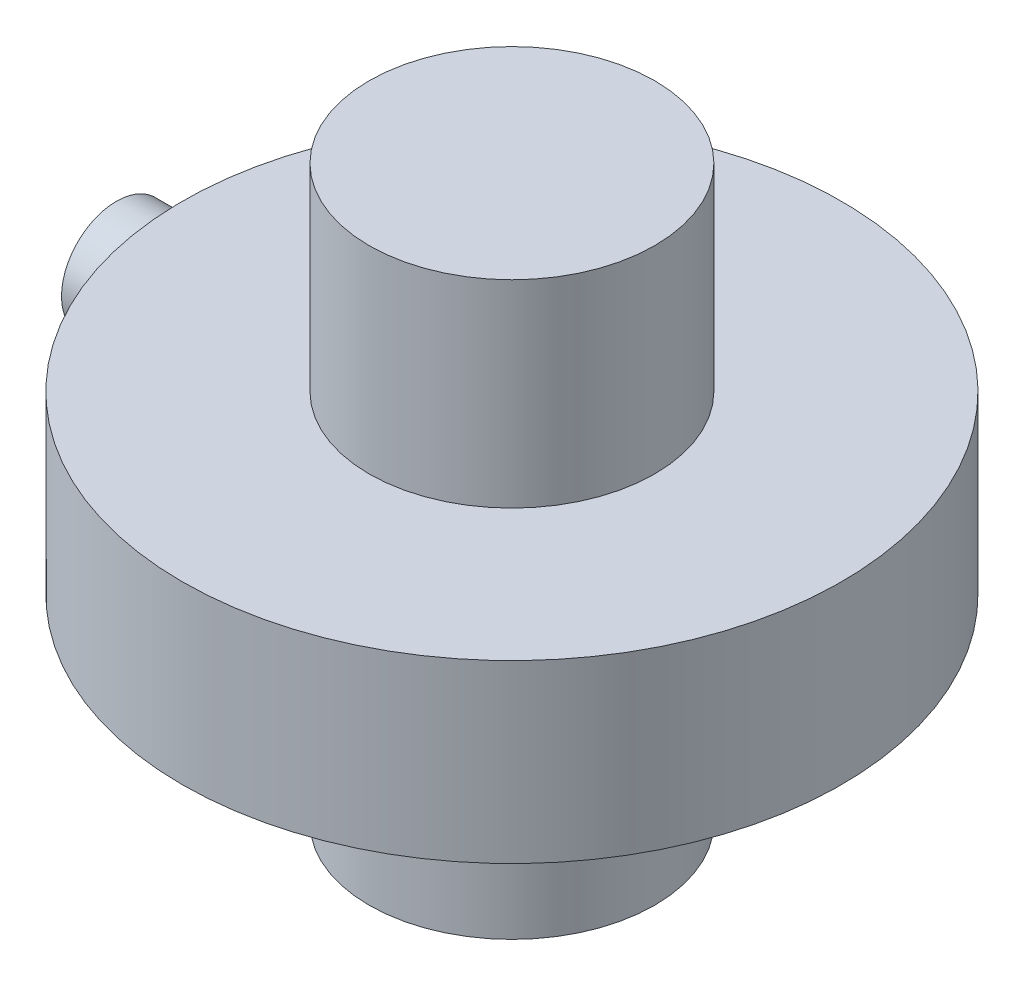
ISO-10303-21;
HEADER;
FILE_DESCRIPTION(('STEP AP214'),'2;1');
FILE_NAME('part.step','',(''),(''),'','','');
FILE_SCHEMA(('AUTOMOTIVE_DESIGN { 1 0 10303 214 1 1 1 1 }'));
ENDSEC;
DATA;
#1=APPLICATION_CONTEXT('core data for automotive mechanical design processes');
#2=APPLICATION_PROTOCOL_DEFINITION('international standard','automotive_design',2000,#1);
#3=PRODUCT_CONTEXT('',#1,'mechanical');
#4=PRODUCT('Part','Part','',(#3));
#5=PRODUCT_RELATED_PRODUCT_CATEGORY('part','',(#4));
#6=PRODUCT_DEFINITION_FORMATION('','',#4);
#7=PRODUCT_DEFINITION_CONTEXT('part definition',#1,'design');
#8=PRODUCT_DEFINITION('design','',#6,#7);
#9=PRODUCT_DEFINITION_SHAPE('','',#8);
#10=(LENGTH_UNIT() NAMED_UNIT(*) SI_UNIT(.MILLI.,.METRE.));
#11=(NAMED_UNIT(*) PLANE_ANGLE_UNIT() SI_UNIT($,.RADIAN.));
#12=(NAMED_UNIT(*) SI_UNIT($,.STERADIAN.) SOLID_ANGLE_UNIT());
#13=UNCERTAINTY_MEASURE_WITH_UNIT(LENGTH_MEASURE(1.E-05),#10,'distance_accuracy_value','');
#14=(GEOMETRIC_REPRESENTATION_CONTEXT(3) GLOBAL_UNCERTAINTY_ASSIGNED_CONTEXT((#13)) GLOBAL_UNIT_ASSIGNED_CONTEXT((#10,
#11,#12)) REPRESENTATION_CONTEXT('',''));
#15=CARTESIAN_POINT('',(0.,0.,0.));
#16=DIRECTION('',(0.,0.,1.));
#17=DIRECTION('',(1.,0.,0.));
#18=AXIS2_PLACEMENT_3D('',#15,#16,#17);
#19=CARTESIAN_POINT('',(10.,0.,0.));
#20=DIRECTION('',(-1.,0.,0.));
#21=DIRECTION('',(0.,0.,1.));
#22=AXIS2_PLACEMENT_3D('',#19,#20,#21);
#23=CYLINDRICAL_SURFACE('',#22,5.);
#24=CARTESIAN_POINT('',(0.,0.,0.));
#25=DIRECTION('',(1.,0.,0.));
#26=DIRECTION('',(0.,0.,-1.));
#27=AXIS2_PLACEMENT_3D('',#24,#25,#26);
#28=CIRCLE('',#27,5.);
#29=CARTESIAN_POINT('',(0.,0.,-5.));
#30=VERTEX_POINT('',#29);
#31=EDGE_CURVE('E50',#30,#30,#28,.T.);
#32=ORIENTED_EDGE('',*,*,#31,.T.);
#33=EDGE_LOOP('',(#32));
#34=FACE_BOUND('',#33,.T.);
#35=CARTESIAN_POINT('',(6.41960108450192,0.,5.));
#36=CARTESIAN_POINT('',(6.41960206738412,-0.139423603737567,5.00000215212787));
#37=CARTESIAN_POINT('',(6.41861343377721,-0.278818119641721,4.9941665012051));
#38=CARTESIAN_POINT('',(6.41468982218339,-0.556647973375644,4.970872204412));
#39=CARTESIAN_POINT('',(6.41175445856882,-0.695083115672044,4.95341125568433));
#40=CARTESIAN_POINT('',(6.40401923247095,-0.970042647516718,4.90698205316677));
#41=CARTESIAN_POINT('',(6.3992181900233,-1.10656577106581,4.87800651661557));
#42=CARTESIAN_POINT('',(6.38788969910231,-1.37669662622056,4.80875805511327));
#43=CARTESIAN_POINT('',(6.38136161674803,-1.51030326784985,4.76848098179349));
#44=CARTESIAN_POINT('',(6.36677742484789,-1.77344871006755,4.67699269476572));
#45=CARTESIAN_POINT('',(6.35872318309313,-1.90299225973115,4.62579483693731));
#46=CARTESIAN_POINT('',(6.34130855087292,-2.15733240147059,4.51279168660919));
#47=CARTESIAN_POINT('',(6.33194767921212,-2.28212722307672,4.45098248431024));
#48=CARTESIAN_POINT('',(6.31219211788758,-2.52600551390402,4.3172476442902));
#49=CARTESIAN_POINT('',(6.30179794168131,-2.64509177658066,4.24532702372849));
#50=CARTESIAN_POINT('',(6.2802593655896,-2.8768565968554,4.09182393832117));
#51=CARTESIAN_POINT('',(6.26911468740961,-2.98953274862279,4.01023788081427));
#52=CARTESIAN_POINT('',(6.24629248062338,-3.20859481292286,3.83725956163011));
#53=CARTESIAN_POINT('',(6.23461124240599,-3.31491946135512,3.74579019488665));
#54=CARTESIAN_POINT('',(6.21112879112474,-3.51954322098023,3.55421801378063));
#55=CARTESIAN_POINT('',(6.19932753524093,-3.61783934609951,3.45411201537784));
#56=CARTESIAN_POINT('',(6.1759434845522,-3.80565753311657,3.2460144077782));
#57=CARTESIAN_POINT('',(6.16436062371278,-3.89518228265489,3.13802523187875));
#58=CARTESIAN_POINT('',(6.14172910674225,-4.06490083691659,2.91483167477465));
#59=CARTESIAN_POINT('',(6.13068064912626,-4.14509118950953,2.79962464827634));
#60=CARTESIAN_POINT('',(6.10937184660013,-4.2959588590913,2.56215441101307));
#61=CARTESIAN_POINT('',(6.09911627739516,-4.3665802079917,2.43985519869266));
#62=CARTESIAN_POINT('',(6.07974959221045,-4.49728399713325,2.18960603977585));
#63=CARTESIAN_POINT('',(6.07063890408677,-4.55736250068995,2.06165400465136));
#64=CARTESIAN_POINT('',(6.05382995637758,-4.66647776334884,1.80108735309577));
#65=CARTESIAN_POINT('',(6.04613110338319,-4.71551916343834,1.6684747236184));
#66=CARTESIAN_POINT('',(6.03235680878144,-4.80223324312405,1.39948700260422));
#67=CARTESIAN_POINT('',(6.02628196025569,-4.83990177002876,1.26311055653696));
#68=CARTESIAN_POINT('',(6.01087718755485,-4.9347309689449,0.852446509264919));
#69=CARTESIAN_POINT('',(6.0041861204119,-4.97485134093692,0.573900376996179));
#70=CARTESIAN_POINT('',(5.99869523073072,-5.00784599839264,0.0141079703099232));
#71=CARTESIAN_POINT('',(5.999894871819,-5.00072349520617,-0.267138119279395));
#72=CARTESIAN_POINT('',(6.00998367176008,-4.93983347051029,-0.821593120474353));
#73=CARTESIAN_POINT('',(6.01879655137127,-4.88652864771911,-1.09485404654849));
#74=CARTESIAN_POINT('',(6.04304019934119,-4.73549887700084,-1.6284869741672));
#75=CARTESIAN_POINT('',(6.05847116925681,-4.63777257619235,-1.88885858289245));
#76=CARTESIAN_POINT('',(6.09434609051671,-4.40021844273726,-2.39071148226925));
#77=CARTESIAN_POINT('',(6.11481266974901,-4.26019990167915,-2.63210082802068));
#78=CARTESIAN_POINT('',(6.15848522228211,-3.94217442889188,-3.08813127772834));
#79=CARTESIAN_POINT('',(6.1816914172286,-3.76416442256136,-3.30277021457954));
#80=CARTESIAN_POINT('',(6.22859463979003,-3.37264236653596,-3.70194248743281));
#81=CARTESIAN_POINT('',(6.25229420656921,-3.15872580477793,-3.88607898857916));
#82=CARTESIAN_POINT('',(6.29724080311382,-2.70282582498852,-4.21590919282353));
#83=CARTESIAN_POINT('',(6.31848781025527,-2.46084214808929,-4.36160254131311));
#84=CARTESIAN_POINT('',(6.35612490908225,-1.95521671478848,-4.61048886472354));
#85=CARTESIAN_POINT('',(6.37250953403029,-1.69155100341863,-4.71363405349992));
#86=CARTESIAN_POINT('',(6.39847622612009,-1.15030185578207,-4.87405974268971));
#87=CARTESIAN_POINT('',(6.40805889222285,-0.872719647267406,-4.93134428151734));
#88=CARTESIAN_POINT('',(6.41922081156826,-0.315067687545065,-4.99786376977689));
#89=CARTESIAN_POINT('',(6.42089428478836,-0.0350672404639543,-5.0076644169312));
#90=CARTESIAN_POINT('',(6.41629930439103,0.522573343249802,-4.98044540425865));
#91=CARTESIAN_POINT('',(6.41003115752653,0.800213570631266,-4.94342755284268));
#92=CARTESIAN_POINT('',(6.39034625073707,1.34345551877588,-4.82410467423498));
#93=CARTESIAN_POINT('',(6.37697496102258,1.60912228119753,-4.74208759766017));
#94=CARTESIAN_POINT('',(6.34462854050045,2.12294033111737,-4.53539636401617));
#95=CARTESIAN_POINT('',(6.32565307446788,2.37109056972945,-4.4107196551057));
#96=CARTESIAN_POINT('',(6.28401742975164,2.84534919423412,-4.12091340811815));
#97=CARTESIAN_POINT('',(6.26132487937048,3.07123316583143,-3.95542135942323));
#98=CARTESIAN_POINT('',(6.21490667502586,3.49222704506926,-3.5891787002952));
#99=CARTESIAN_POINT('',(6.19118094848652,3.68733478635632,-3.38842560992089));
#100=CARTESIAN_POINT('',(6.14507152510677,4.04330386210953,-2.95485701247823));
#101=CARTESIAN_POINT('',(6.12270435112166,4.2037879400263,-2.72172977623534));
#102=CARTESIAN_POINT('',(6.0820978733221,4.48331036656184,-2.23148362654147));
#103=CARTESIAN_POINT('',(6.06385843599049,4.60235005582178,-1.97436548948827));
#104=CARTESIAN_POINT('',(6.03363238322118,4.79502223631592,-1.44461025477472));
#105=CARTESIAN_POINT('',(6.02161861999736,4.86885213077165,-1.17204638474136));
#106=CARTESIAN_POINT('',(6.0050900251256,4.96962721895332,-0.618016213936818));
#107=CARTESIAN_POINT('',(6.00057457645095,4.99657627045259,-0.336550647617409));
#108=CARTESIAN_POINT('',(5.99979154187963,5.00123900166298,0.0840513236235064));
#109=CARTESIAN_POINT('',(6.00050843041695,4.9969552500374,0.223209655690205));
#110=CARTESIAN_POINT('',(6.00385815201409,4.97681179916624,0.500648669793314));
#111=CARTESIAN_POINT('',(6.00649026538129,4.96095644822564,0.638929661828224));
#112=CARTESIAN_POINT('',(6.01360142975362,4.91777830123445,0.913680965571356));
#113=CARTESIAN_POINT('',(6.0180811368882,4.89045143128229,1.05015061623527));
#114=CARTESIAN_POINT('',(6.02875961303507,4.82455263790403,1.32022824391753));
#115=CARTESIAN_POINT('',(6.03495776254872,4.78598476660363,1.45383723354143));
#116=CARTESIAN_POINT('',(6.04889676686995,4.69792202629723,1.71720548972901));
#117=CARTESIAN_POINT('',(6.05663643621005,4.64843555083949,1.84696762706274));
#118=CARTESIAN_POINT('',(6.0734449144954,4.53890133611621,2.10180951631926));
#119=CARTESIAN_POINT('',(6.08251324674165,4.47885738313369,2.22689092747563));
#120=CARTESIAN_POINT('',(6.10173612253064,4.34860111233806,2.47161697545382));
#121=CARTESIAN_POINT('',(6.11189108957435,4.27838482619745,2.59125946645759));
#122=CARTESIAN_POINT('',(6.13300275095835,4.1283215520988,2.8242079991635));
#123=CARTESIAN_POINT('',(6.14395916271153,4.04847795232698,2.93751624967617));
#124=CARTESIAN_POINT('',(6.16651078469153,3.87869044633627,3.15838432816091));
#125=CARTESIAN_POINT('',(6.17811201860481,3.78863822668804,3.26586029407928));
#126=CARTESIAN_POINT('',(6.20150447343322,3.59987513111967,3.47282432265109));
#127=CARTESIAN_POINT('',(6.21329562502612,3.50116735862164,3.57231522401814));
#128=CARTESIAN_POINT('',(6.23674935287912,3.29568067050576,3.76272784850023));
#129=CARTESIAN_POINT('',(6.24841184782836,3.18889695214774,3.85364439911055));
#130=CARTESIAN_POINT('',(6.2712688507171,2.9680815442526,4.02617893630592));
#131=CARTESIAN_POINT('',(6.28246352963315,2.85405254180005,4.10780033921658));
#132=CARTESIAN_POINT('',(6.30415353180715,2.61861343628858,4.26178317336446));
#133=CARTESIAN_POINT('',(6.31464300897476,2.49715457747588,4.33407091155741));
#134=CARTESIAN_POINT('',(6.33452272314691,2.24853065164891,4.46811470952359));
#135=CARTESIAN_POINT('',(6.34391336418492,2.12136770592506,4.5298746441277));
#136=CARTESIAN_POINT('',(6.36131943788543,1.86227598753968,4.6423978626488));
#137=CARTESIAN_POINT('',(6.36933582774018,1.7303506101737,4.69316880713277));
#138=CARTESIAN_POINT('',(6.3837639369376,1.46263975730989,4.78337130570409));
#139=CARTESIAN_POINT('',(6.39017600123176,1.32685511860898,4.82280529766023));
#140=CARTESIAN_POINT('',(6.40349748483601,0.995277925420921,4.90401989375999));
#141=CARTESIAN_POINT('',(6.40950688383293,0.797990596501737,4.93996956730933));
#142=CARTESIAN_POINT('',(6.41755794200455,0.400448818701822,4.98795785830044));
#143=CARTESIAN_POINT('',(6.41959967320905,0.200194423752271,4.99999690982024));
#144=CARTESIAN_POINT('',(6.41960108450192,0.,5.));
#145=B_SPLINE_CURVE_WITH_KNOTS('',3,(#35,#36,#37,#38,#39,#40,#41,#42,#43,#44,#45,#46,#47,#48,
#49,#50,#51,#52,#53,#54,#55,#56,#57,#58,#59,#60,#61,#62,#63,#64,#65,#66,#67,#68,#69,#70,#71,#72,
#73,#74,#75,#76,#77,#78,#79,#80,#81,#82,#83,#84,#85,#86,#87,#88,#89,#90,#91,#92,#93,#94,#95,#96,
#97,#98,#99,#100,#101,#102,#103,#104,#105,#106,#107,#108,#109,#110,#111,#112,#113,#114,#115,
#116,#117,#118,#119,#120,#121,#122,#123,#124,#125,#126,#127,#128,#129,#130,#131,#132,#133,#134,
#135,#136,#137,#138,#139,#140,#141,#142,#143,#144),.UNSPECIFIED.,.T.,.F.,(4,2,2,2,2,2,2,2,2,2,2,
2,2,2,2,2,2,2,2,2,2,2,2,2,2,2,2,2,2,2,2,2,2,2,2,2,2,2,2,2,2,2,2,2,2,2,2,2,2,2,2,2,2,2,4),(0.,
0.418095242549753,0.836273330312913,1.25471632992754,1.67331312559436,2.09140089204124,
2.50964303678586,2.92767838265871,3.34586960348905,3.76759791918756,4.18948238202711,
4.61123716813953,5.03314743913425,5.45742771408346,5.88186607917447,6.30612563749768,
6.73053992314499,7.57061257037404,8.41062811397657,9.2423236442161,10.0740445059134,
10.9095733037112,11.745169745458,12.5909036901652,13.4366454358431,14.2833344708948,
15.1299489396843,15.9664520693309,16.8029228892023,17.6341025136326,18.4653318667942,
19.3042280761768,20.1431833095365,20.9908634816304,21.8385162304567,22.6824409092757,
23.5262961391698,23.9435677338948,24.3606826095272,24.7779457414127,25.1950586450546,
25.6118520083923,26.0284961987167,26.4453033659293,26.8619642700311,27.2835543146455,
27.7049938127194,28.1266859407461,28.5482225769884,28.9729067446496,29.3974342652835,
29.8216648822648,30.2458042054463,30.8461462814325,31.4464774585936),.UNSPECIFIED.);
#146=CARTESIAN_POINT('',(6.41960108450192,0.,5.));
#147=VERTEX_POINT('',#146);
#148=EDGE_CURVE('E46',#147,#147,#145,.T.);
#149=ORIENTED_EDGE('',*,*,#148,.F.);
#150=EDGE_LOOP('',(#149));
#151=FACE_BOUND('',#150,.T.);
#152=ADVANCED_FACE('F39',(#34,#151),#23,.T.);
#153=CARTESIAN_POINT('',(0.,0.,0.));
#154=DIRECTION('',(1.,0.,0.));
#155=DIRECTION('',(0.,0.,-1.));
#156=AXIS2_PLACEMENT_3D('',#153,#154,#155);
#157=PLANE('',#156);
#158=ORIENTED_EDGE('',*,*,#31,.F.);
#159=EDGE_LOOP('',(#158));
#160=FACE_BOUND('',#159,.T.);
#161=ADVANCED_FACE('F66',(#160),#157,.F.);
#162=CARTESIAN_POINT('',(36.,8.,0.));
#163=DIRECTION('',(0.,-1.,0.));
#164=DIRECTION('',(0.,0.,-1.));
#165=AXIS2_PLACEMENT_3D('',#162,#163,#164);
#166=CYLINDRICAL_SURFACE('',#165,30.);
#167=CARTESIAN_POINT('',(36.,-8.,0.));
#168=DIRECTION('',(0.,1.,0.));
#169=DIRECTION('',(0.,0.,1.));
#170=AXIS2_PLACEMENT_3D('',#167,#168,#169);
#171=CIRCLE('',#170,30.);
#172=CARTESIAN_POINT('',(36.,-8.,30.));
#173=VERTEX_POINT('',#172);
#174=EDGE_CURVE('E152',#173,#173,#171,.T.);
#175=ORIENTED_EDGE('',*,*,#174,.T.);
#176=EDGE_LOOP('',(#175));
#177=FACE_BOUND('',#176,.T.);
#178=CARTESIAN_POINT('',(36.,8.,0.));
#179=DIRECTION('',(0.,1.,0.));
#180=DIRECTION('',(0.,0.,1.));
#181=AXIS2_PLACEMENT_3D('',#178,#179,#180);
#182=CIRCLE('',#181,30.);
#183=CARTESIAN_POINT('',(36.,8.,30.));
#184=VERTEX_POINT('',#183);
#185=EDGE_CURVE('E54',#184,#184,#182,.T.);
#186=ORIENTED_EDGE('',*,*,#185,.F.);
#187=EDGE_LOOP('',(#186));
#188=FACE_BOUND('',#187,.T.);
#189=ORIENTED_EDGE('',*,*,#148,.T.);
#190=EDGE_LOOP('',(#189));
#191=FACE_BOUND('',#190,.T.);
#192=ADVANCED_FACE('F61',(#177,#188,#191),#166,.T.);
#193=CARTESIAN_POINT('',(36.,8.,0.));
#194=DIRECTION('',(0.,1.,0.));
#195=DIRECTION('',(0.,0.,1.));
#196=AXIS2_PLACEMENT_3D('',#193,#194,#195);
#197=PLANE('',#196);
#198=CARTESIAN_POINT('',(36.,8.,0.));
#199=DIRECTION('',(0.,1.,0.));
#200=DIRECTION('',(0.,0.,1.));
#201=AXIS2_PLACEMENT_3D('',#198,#199,#200);
#202=CIRCLE('',#201,13.);
#203=CARTESIAN_POINT('',(36.,8.,-13.));
#204=VERTEX_POINT('',#203);
#205=EDGE_CURVE('E148',#204,#204,#202,.F.);
#206=ORIENTED_EDGE('',*,*,#205,.T.);
#207=EDGE_LOOP('',(#206));
#208=FACE_BOUND('',#207,.T.);
#209=ORIENTED_EDGE('',*,*,#185,.T.);
#210=EDGE_LOOP('',(#209));
#211=FACE_BOUND('',#210,.T.);
#212=ADVANCED_FACE('F65',(#208,#211),#197,.T.);
#213=CARTESIAN_POINT('',(36.,-8.,0.));
#214=DIRECTION('',(0.,1.,0.));
#215=DIRECTION('',(0.,0.,1.));
#216=AXIS2_PLACEMENT_3D('',#213,#214,#215);
#217=PLANE('',#216);
#218=CARTESIAN_POINT('',(36.,-8.,0.));
#219=DIRECTION('',(0.,1.,0.));
#220=DIRECTION('',(0.,0.,1.));
#221=AXIS2_PLACEMENT_3D('',#218,#219,#220);
#222=CIRCLE('',#221,13.);
#223=CARTESIAN_POINT('',(36.,-8.00000000000001,-13.));
#224=VERTEX_POINT('',#223);
#225=EDGE_CURVE('E10',#224,#224,#222,.F.);
#226=ORIENTED_EDGE('',*,*,#225,.F.);
#227=EDGE_LOOP('',(#226));
#228=FACE_BOUND('',#227,.T.);
#229=ORIENTED_EDGE('',*,*,#174,.F.);
#230=EDGE_LOOP('',(#229));
#231=FACE_BOUND('',#230,.T.);
#232=ADVANCED_FACE('F68',(#228,#231),#217,.F.);
#233=CARTESIAN_POINT('',(36.,-26.,0.));
#234=DIRECTION('',(0.,1.,0.));
#235=DIRECTION('',(0.,0.,1.));
#236=AXIS2_PLACEMENT_3D('',#233,#234,#235);
#237=PLANE('',#236);
#238=CARTESIAN_POINT('',(36.,-26.,0.));
#239=DIRECTION('',(0.,1.,0.));
#240=DIRECTION('',(0.,0.,1.));
#241=AXIS2_PLACEMENT_3D('',#238,#239,#240);
#242=CIRCLE('',#241,13.);
#243=CARTESIAN_POINT('',(36.,-26.,-13.));
#244=VERTEX_POINT('',#243);
#245=EDGE_CURVE('E149',#244,#244,#242,.T.);
#246=ORIENTED_EDGE('',*,*,#245,.F.);
#247=EDGE_LOOP('',(#246));
#248=FACE_BOUND('',#247,.T.);
#249=ADVANCED_FACE('F99',(#248),#237,.F.);
#250=CARTESIAN_POINT('',(36.,26.,0.));
#251=DIRECTION('',(0.,-1.,0.));
#252=DIRECTION('',(0.,0.,-1.));
#253=AXIS2_PLACEMENT_3D('',#250,#251,#252);
#254=CYLINDRICAL_SURFACE('',#253,13.);
#255=CARTESIAN_POINT('',(36.,-26.,-13.));
#256=CARTESIAN_POINT('',(36.,-25.8125,-13.));
#257=CARTESIAN_POINT('',(36.,-25.625,-13.));
#258=CARTESIAN_POINT('',(36.,-25.25,-13.));
#259=CARTESIAN_POINT('',(36.,-25.0625,-13.));
#260=CARTESIAN_POINT('',(36.,-24.6875,-13.));
#261=CARTESIAN_POINT('',(36.,-24.5,-13.));
#262=CARTESIAN_POINT('',(36.,-24.125,-13.));
#263=CARTESIAN_POINT('',(36.,-23.9375,-13.));
#264=CARTESIAN_POINT('',(36.,-23.5625,-13.));
#265=CARTESIAN_POINT('',(36.,-23.375,-13.));
#266=CARTESIAN_POINT('',(36.,-23.,-13.));
#267=CARTESIAN_POINT('',(36.,-22.8125,-13.));
#268=CARTESIAN_POINT('',(36.,-22.4375,-13.));
#269=CARTESIAN_POINT('',(36.,-22.25,-13.));
#270=CARTESIAN_POINT('',(36.,-21.875,-13.));
#271=CARTESIAN_POINT('',(36.,-21.6875,-13.));
#272=CARTESIAN_POINT('',(36.,-21.3125,-13.));
#273=CARTESIAN_POINT('',(36.,-21.125,-13.));
#274=CARTESIAN_POINT('',(36.,-20.75,-13.));
#275=CARTESIAN_POINT('',(36.,-20.5625,-13.));
#276=CARTESIAN_POINT('',(36.,-20.1875,-13.));
#277=CARTESIAN_POINT('',(36.,-20.,-13.));
#278=CARTESIAN_POINT('',(36.,-19.625,-13.));
#279=CARTESIAN_POINT('',(36.,-19.4375,-13.));
#280=CARTESIAN_POINT('',(36.,-19.0625,-13.));
#281=CARTESIAN_POINT('',(36.,-18.875,-13.));
#282=CARTESIAN_POINT('',(36.,-18.5,-13.));
#283=CARTESIAN_POINT('',(36.,-18.3125,-13.));
#284=CARTESIAN_POINT('',(36.,-17.9375,-13.));
#285=CARTESIAN_POINT('',(36.,-17.75,-13.));
#286=CARTESIAN_POINT('',(36.,-17.375,-13.));
#287=CARTESIAN_POINT('',(36.,-17.1875,-13.));
#288=CARTESIAN_POINT('',(36.,-16.8125,-13.));
#289=CARTESIAN_POINT('',(36.,-16.625,-13.));
#290=CARTESIAN_POINT('',(36.,-16.25,-13.));
#291=CARTESIAN_POINT('',(36.,-16.0625,-13.));
#292=CARTESIAN_POINT('',(36.,-15.6875,-13.));
#293=CARTESIAN_POINT('',(36.,-15.5,-13.));
#294=CARTESIAN_POINT('',(36.,-15.125,-13.));
#295=CARTESIAN_POINT('',(36.,-14.9375,-13.));
#296=CARTESIAN_POINT('',(36.,-14.5625,-13.));
#297=CARTESIAN_POINT('',(36.,-14.375,-13.));
#298=CARTESIAN_POINT('',(36.,-14.,-13.));
#299=CARTESIAN_POINT('',(36.,-13.8125,-13.));
#300=CARTESIAN_POINT('',(36.,-13.4375,-13.));
#301=CARTESIAN_POINT('',(36.,-13.25,-13.));
#302=CARTESIAN_POINT('',(36.,-12.875,-13.));
#303=CARTESIAN_POINT('',(36.,-12.6875,-13.));
#304=CARTESIAN_POINT('',(36.,-12.3125,-13.));
#305=CARTESIAN_POINT('',(36.,-12.125,-13.));
#306=CARTESIAN_POINT('',(36.,-11.75,-13.));
#307=CARTESIAN_POINT('',(36.,-11.5625,-13.));
#308=CARTESIAN_POINT('',(36.,-11.1875,-13.));
#309=CARTESIAN_POINT('',(36.,-11.,-13.));
#310=CARTESIAN_POINT('',(36.,-10.625,-13.));
#311=CARTESIAN_POINT('',(36.,-10.4375,-13.));
#312=CARTESIAN_POINT('',(36.,-10.0625,-13.));
#313=CARTESIAN_POINT('',(36.,-9.87500000000001,-13.));
#314=CARTESIAN_POINT('',(36.,-9.50000000000001,-13.));
#315=CARTESIAN_POINT('',(36.,-9.31250000000001,-13.));
#316=CARTESIAN_POINT('',(36.,-8.93750000000001,-13.));
#317=CARTESIAN_POINT('',(36.,-8.75000000000001,-13.));
#318=CARTESIAN_POINT('',(36.,-8.37500000000001,-13.));
#319=CARTESIAN_POINT('',(36.,-8.18750000000001,-13.));
#320=CARTESIAN_POINT('',(36.,-8.00000000000001,-13.));
#321=B_SPLINE_CURVE_WITH_KNOTS('',3,(#255,#256,#257,#258,#259,#260,#261,#262,#263,#264,#265,
#266,#267,#268,#269,#270,#271,#272,#273,#274,#275,#276,#277,#278,#279,#280,#281,#282,#283,#284,
#285,#286,#287,#288,#289,#290,#291,#292,#293,#294,#295,#296,#297,#298,#299,#300,#301,#302,#303,
#304,#305,#306,#307,#308,#309,#310,#311,#312,#313,#314,#315,#316,#317,#318,#319,#320),
.UNSPECIFIED.,.F.,.F.,(4,2,2,2,2,2,2,2,2,2,2,2,2,2,2,2,2,2,2,2,2,2,2,2,2,2,2,2,2,2,2,2,4),(0.,
0.5625,1.125,1.6875,2.25,2.8125,3.375,3.9375,4.5,5.0625,5.625,6.1875,6.74999999999999,
7.31249999999999,7.87499999999999,8.43749999999999,8.99999999999999,9.56249999999999,10.125,
10.6875,11.25,11.8125,12.375,12.9375,13.5,14.0625,14.625,15.1875,15.75,16.3125,16.875,17.4375,
18.),.UNSPECIFIED.);
#322=EDGE_CURVE('BSEAM107',#244,#224,#321,.T.);
#323=ORIENTED_EDGE('',*,*,#245,.T.);
#324=ORIENTED_EDGE('',*,*,#225,.T.);
#325=ORIENTED_EDGE('',*,*,#322,.T.);
#326=ORIENTED_EDGE('',*,*,#322,.F.);
#327=EDGE_LOOP('',(#323,#325,#324,#326));
#328=FACE_BOUND('',#327,.T.);
#329=ADVANCED_FACE('F107',(#328),#254,.T.);
#330=CARTESIAN_POINT('',(36.,26.,0.));
#331=DIRECTION('',(0.,1.,0.));
#332=DIRECTION('',(0.,0.,1.));
#333=AXIS2_PLACEMENT_3D('',#330,#331,#332);
#334=CIRCLE('',#333,13.);
#335=CARTESIAN_POINT('',(36.,26.,-13.));
#336=VERTEX_POINT('',#335);
#337=EDGE_CURVE('E146',#336,#336,#334,.T.);
#338=CARTESIAN_POINT('',(36.,8.,-13.));
#339=CARTESIAN_POINT('',(36.,8.1875,-13.));
#340=CARTESIAN_POINT('',(36.,8.375,-13.));
#341=CARTESIAN_POINT('',(36.,8.75,-13.));
#342=CARTESIAN_POINT('',(36.,8.9375,-13.));
#343=CARTESIAN_POINT('',(36.,9.3125,-13.));
#344=CARTESIAN_POINT('',(36.,9.5,-13.));
#345=CARTESIAN_POINT('',(36.,9.875,-13.));
#346=CARTESIAN_POINT('',(36.,10.0625,-13.));
#347=CARTESIAN_POINT('',(36.,10.4375,-13.));
#348=CARTESIAN_POINT('',(36.,10.625,-13.));
#349=CARTESIAN_POINT('',(36.,11.,-13.));
#350=CARTESIAN_POINT('',(36.,11.1875,-13.));
#351=CARTESIAN_POINT('',(36.,11.5625,-13.));
#352=CARTESIAN_POINT('',(36.,11.75,-13.));
#353=CARTESIAN_POINT('',(36.,12.125,-13.));
#354=CARTESIAN_POINT('',(36.,12.3125,-13.));
#355=CARTESIAN_POINT('',(36.,12.6875,-13.));
#356=CARTESIAN_POINT('',(36.,12.875,-13.));
#357=CARTESIAN_POINT('',(36.,13.25,-13.));
#358=CARTESIAN_POINT('',(36.,13.4375,-13.));
#359=CARTESIAN_POINT('',(36.,13.8125,-13.));
#360=CARTESIAN_POINT('',(36.,14.,-13.));
#361=CARTESIAN_POINT('',(36.,14.375,-13.));
#362=CARTESIAN_POINT('',(36.,14.5625,-13.));
#363=CARTESIAN_POINT('',(36.,14.9375,-13.));
#364=CARTESIAN_POINT('',(36.,15.125,-13.));
#365=CARTESIAN_POINT('',(36.,15.5,-13.));
#366=CARTESIAN_POINT('',(36.,15.6875,-13.));
#367=CARTESIAN_POINT('',(36.,16.0625,-13.));
#368=CARTESIAN_POINT('',(36.,16.25,-13.));
#369=CARTESIAN_POINT('',(36.,16.625,-13.));
#370=CARTESIAN_POINT('',(36.,16.8125,-13.));
#371=CARTESIAN_POINT('',(36.,17.1875,-13.));
#372=CARTESIAN_POINT('',(36.,17.375,-13.));
#373=CARTESIAN_POINT('',(36.,17.75,-13.));
#374=CARTESIAN_POINT('',(36.,17.9375,-13.));
#375=CARTESIAN_POINT('',(36.,18.3125,-13.));
#376=CARTESIAN_POINT('',(36.,18.5,-13.));
#377=CARTESIAN_POINT('',(36.,18.875,-13.));
#378=CARTESIAN_POINT('',(36.,19.0625,-13.));
#379=CARTESIAN_POINT('',(36.,19.4375,-13.));
#380=CARTESIAN_POINT('',(36.,19.625,-13.));
#381=CARTESIAN_POINT('',(36.,20.,-13.));
#382=CARTESIAN_POINT('',(36.,20.1875,-13.));
#383=CARTESIAN_POINT('',(36.,20.5625,-13.));
#384=CARTESIAN_POINT('',(36.,20.75,-13.));
#385=CARTESIAN_POINT('',(36.,21.125,-13.));
#386=CARTESIAN_POINT('',(36.,21.3125,-13.));
#387=CARTESIAN_POINT('',(36.,21.6875,-13.));
#388=CARTESIAN_POINT('',(36.,21.875,-13.));
#389=CARTESIAN_POINT('',(36.,22.25,-13.));
#390=CARTESIAN_POINT('',(36.,22.4375,-13.));
#391=CARTESIAN_POINT('',(36.,22.8125,-13.));
#392=CARTESIAN_POINT('',(36.,23.,-13.));
#393=CARTESIAN_POINT('',(36.,23.375,-13.));
#394=CARTESIAN_POINT('',(36.,23.5625,-13.));
#395=CARTESIAN_POINT('',(36.,23.9375,-13.));
#396=CARTESIAN_POINT('',(36.,24.125,-13.));
#397=CARTESIAN_POINT('',(36.,24.5,-13.));
#398=CARTESIAN_POINT('',(36.,24.6875,-13.));
#399=CARTESIAN_POINT('',(36.,25.0625,-13.));
#400=CARTESIAN_POINT('',(36.,25.25,-13.));
#401=CARTESIAN_POINT('',(36.,25.625,-13.));
#402=CARTESIAN_POINT('',(36.,25.8125,-13.));
#403=CARTESIAN_POINT('',(36.,26.,-13.));
#404=B_SPLINE_CURVE_WITH_KNOTS('',3,(#338,#339,#340,#341,#342,#343,#344,#345,#346,#347,#348,
#349,#350,#351,#352,#353,#354,#355,#356,#357,#358,#359,#360,#361,#362,#363,#364,#365,#366,#367,
#368,#369,#370,#371,#372,#373,#374,#375,#376,#377,#378,#379,#380,#381,#382,#383,#384,#385,#386,
#387,#388,#389,#390,#391,#392,#393,#394,#395,#396,#397,#398,#399,#400,#401,#402,#403),
.UNSPECIFIED.,.F.,.F.,(4,2,2,2,2,2,2,2,2,2,2,2,2,2,2,2,2,2,2,2,2,2,2,2,2,2,2,2,2,2,2,2,4),(0.,
0.5625,1.125,1.6875,2.25,2.8125,3.375,3.9375,4.5,5.0625,5.625,6.1875,6.75,7.3125,7.875,8.4375,
9.,9.5625,10.125,10.6875,11.25,11.8125,12.375,12.9375,13.5,14.0625,14.625,15.1875,15.75,16.3125,
16.875,17.4375,18.),.UNSPECIFIED.);
#405=EDGE_CURVE('BSEAM116',#204,#336,#404,.T.);
#406=ORIENTED_EDGE('',*,*,#205,.F.);
#407=ORIENTED_EDGE('',*,*,#337,.F.);
#408=ORIENTED_EDGE('',*,*,#405,.T.);
#409=ORIENTED_EDGE('',*,*,#405,.F.);
#410=EDGE_LOOP('',(#406,#408,#407,#409));
#411=FACE_BOUND('',#410,.T.);
#412=ADVANCED_FACE('F116',(#411),#254,.T.);
#413=CARTESIAN_POINT('',(36.,26.,0.));
#414=DIRECTION('',(0.,1.,0.));
#415=DIRECTION('',(0.,0.,1.));
#416=AXIS2_PLACEMENT_3D('',#413,#414,#415);
#417=PLANE('',#416);
#418=ORIENTED_EDGE('',*,*,#337,.T.);
#419=EDGE_LOOP('',(#418));
#420=FACE_BOUND('',#419,.T.);
#421=ADVANCED_FACE('F125',(#420),#417,.T.);
#422=CLOSED_SHELL('',(#152,#161,#192,#212,#232,#249,#329,#412,#421));
#423=MANIFOLD_SOLID_BREP('B2',#422);
#424=ADVANCED_BREP_SHAPE_REPRESENTATION('',(#18,#423),#14);
#425=SHAPE_DEFINITION_REPRESENTATION(#9,#424);
ENDSEC;
END-ISO-10303-21;
